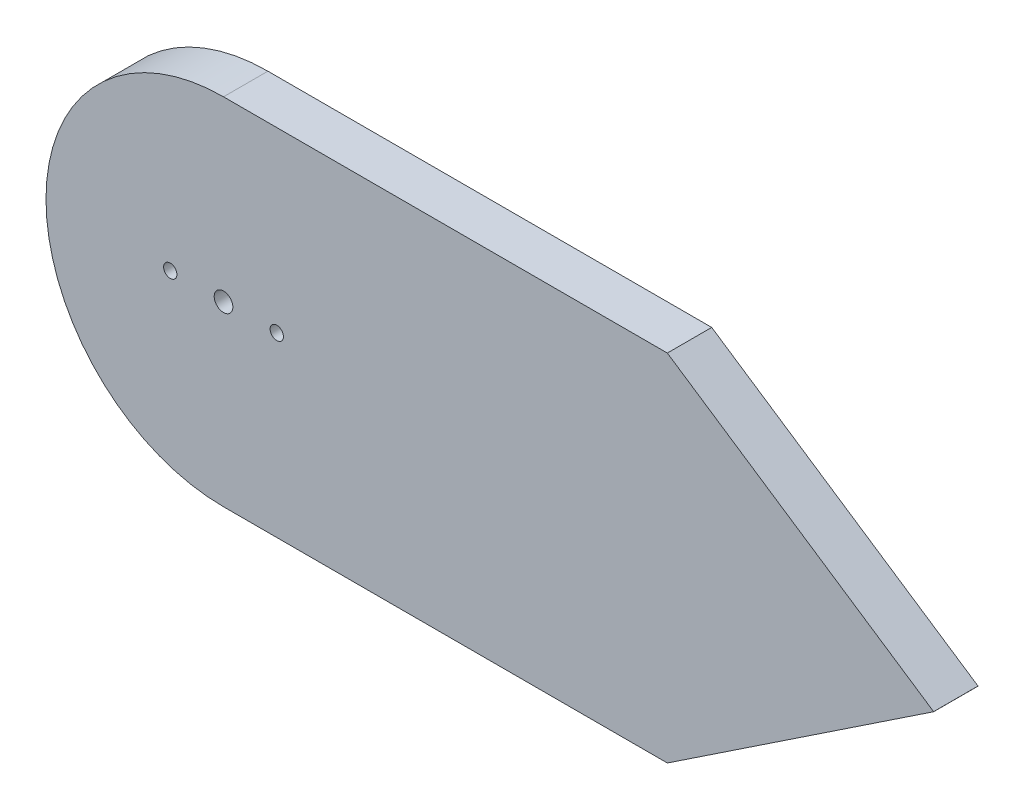
ISO-10303-21;
HEADER;
FILE_DESCRIPTION(('STEP AP214'),'2;1');
FILE_NAME('part.step','',(''),(''),'','','');
FILE_SCHEMA(('AUTOMOTIVE_DESIGN { 1 0 10303 214 1 1 1 1 }'));
ENDSEC;
DATA;
#1=APPLICATION_CONTEXT('core data for automotive mechanical design processes');
#2=APPLICATION_PROTOCOL_DEFINITION('international standard','automotive_design',2000,#1);
#3=PRODUCT_CONTEXT('',#1,'mechanical');
#4=PRODUCT('Part','Part','',(#3));
#5=PRODUCT_RELATED_PRODUCT_CATEGORY('part','',(#4));
#6=PRODUCT_DEFINITION_FORMATION('','',#4);
#7=PRODUCT_DEFINITION_CONTEXT('part definition',#1,'design');
#8=PRODUCT_DEFINITION('design','',#6,#7);
#9=PRODUCT_DEFINITION_SHAPE('','',#8);
#10=(LENGTH_UNIT() NAMED_UNIT(*) SI_UNIT(.MILLI.,.METRE.));
#11=(NAMED_UNIT(*) PLANE_ANGLE_UNIT() SI_UNIT($,.RADIAN.));
#12=(NAMED_UNIT(*) SI_UNIT($,.STERADIAN.) SOLID_ANGLE_UNIT());
#13=UNCERTAINTY_MEASURE_WITH_UNIT(LENGTH_MEASURE(1.E-05),#10,'distance_accuracy_value','');
#14=(GEOMETRIC_REPRESENTATION_CONTEXT(3) GLOBAL_UNCERTAINTY_ASSIGNED_CONTEXT((#13)) GLOBAL_UNIT_ASSIGNED_CONTEXT((#10,
#11,#12)) REPRESENTATION_CONTEXT('',''));
#15=CARTESIAN_POINT('',(0.,0.,0.));
#16=DIRECTION('',(0.,0.,1.));
#17=DIRECTION('',(1.,0.,0.));
#18=AXIS2_PLACEMENT_3D('',#15,#16,#17);
#19=CARTESIAN_POINT('',(0.,0.,2.));
#20=DIRECTION('',(0.,0.,-1.));
#21=DIRECTION('',(0.,1.,0.));
#22=AXIS2_PLACEMENT_3D('',#19,#20,#21);
#23=CYLINDRICAL_SURFACE('',#22,20.);
#24=CARTESIAN_POINT('',(0.,0.,-3.));
#25=DIRECTION('',(0.,0.,1.));
#26=DIRECTION('',(0.,-1.,0.));
#27=AXIS2_PLACEMENT_3D('',#24,#25,#26);
#28=CIRCLE('',#27,20.);
#29=CARTESIAN_POINT('',(0.,20.,-2.99999999999993));
#30=VERTEX_POINT('',#29);
#31=CARTESIAN_POINT('',(0.,-20.,-3.00000000000007));
#32=VERTEX_POINT('',#31);
#33=EDGE_CURVE('E127',#30,#32,#28,.T.);
#34=ORIENTED_EDGE('',*,*,#33,.T.);
#35=DIRECTION('',(0.,0.,-1.));
#36=VECTOR('',#35,1.);
#37=CARTESIAN_POINT('',(0.,-20.,1.99999999999993));
#38=LINE('',#37,#36);
#39=CARTESIAN_POINT('',(0.,-20.,1.99999999999993));
#40=VERTEX_POINT('',#39);
#41=EDGE_CURVE('E11',#40,#32,#38,.T.);
#42=ORIENTED_EDGE('',*,*,#41,.F.);
#43=CARTESIAN_POINT('',(0.,0.,2.));
#44=DIRECTION('',(0.,0.,1.));
#45=DIRECTION('',(0.,-1.,0.));
#46=AXIS2_PLACEMENT_3D('',#43,#44,#45);
#47=CIRCLE('',#46,20.);
#48=CARTESIAN_POINT('',(0.,20.,2.00000000000007));
#49=VERTEX_POINT('',#48);
#50=EDGE_CURVE('E87',#49,#40,#47,.T.);
#51=ORIENTED_EDGE('',*,*,#50,.F.);
#52=DIRECTION('',(0.,0.,-1.));
#53=VECTOR('',#52,1.);
#54=CARTESIAN_POINT('',(0.,20.,2.00000000000007));
#55=LINE('',#54,#53);
#56=EDGE_CURVE('E56',#49,#30,#55,.T.);
#57=ORIENTED_EDGE('',*,*,#56,.T.);
#58=EDGE_LOOP('',(#34,#42,#51,#57));
#59=FACE_BOUND('',#58,.T.);
#60=ADVANCED_FACE('F39',(#59),#23,.T.);
#61=CARTESIAN_POINT('',(50.,-20.,1.99999999999993));
#62=DIRECTION('',(0.,-1.,0.));
#63=DIRECTION('',(1.,0.,0.));
#64=AXIS2_PLACEMENT_3D('',#61,#62,#63);
#65=PLANE('',#64);
#66=DIRECTION('',(-1.,0.,0.));
#67=VECTOR('',#66,1.);
#68=CARTESIAN_POINT('',(50.,-20.,-3.00000000000007));
#69=LINE('',#68,#67);
#70=CARTESIAN_POINT('',(50.,-20.,-3.00000000000007));
#71=VERTEX_POINT('',#70);
#72=EDGE_CURVE('E130',#71,#32,#69,.T.);
#73=ORIENTED_EDGE('',*,*,#72,.F.);
#74=DIRECTION('',(0.,0.,-1.));
#75=VECTOR('',#74,1.);
#76=CARTESIAN_POINT('',(50.,-20.,1.99999999999993));
#77=LINE('',#76,#75);
#78=CARTESIAN_POINT('',(50.,-20.,1.99999999999993));
#79=VERTEX_POINT('',#78);
#80=EDGE_CURVE('E48',#79,#71,#77,.T.);
#81=ORIENTED_EDGE('',*,*,#80,.F.);
#82=DIRECTION('',(-1.,0.,0.));
#83=VECTOR('',#82,1.);
#84=CARTESIAN_POINT('',(50.,-20.,1.99999999999993));
#85=LINE('',#84,#83);
#86=EDGE_CURVE('E179',#79,#40,#85,.T.);
#87=ORIENTED_EDGE('',*,*,#86,.T.);
#88=ORIENTED_EDGE('',*,*,#41,.T.);
#89=EDGE_LOOP('',(#73,#81,#87,#88));
#90=FACE_BOUND('',#89,.T.);
#91=ADVANCED_FACE('F161',(#90),#65,.T.);
#92=CARTESIAN_POINT('',(80.,0.,2.));
#93=DIRECTION('',(0.554700196225229,-0.832050294337844,0.));
#94=DIRECTION('',(0.832050294337844,0.554700196225229,0.));
#95=AXIS2_PLACEMENT_3D('',#92,#93,#94);
#96=PLANE('',#95);
#97=DIRECTION('',(-0.832050294337844,-0.554700196225229,0.));
#98=VECTOR('',#97,1.);
#99=CARTESIAN_POINT('',(80.,0.,-3.));
#100=LINE('',#99,#98);
#101=CARTESIAN_POINT('',(80.,0.,-3.));
#102=VERTEX_POINT('',#101);
#103=EDGE_CURVE('E135',#102,#71,#100,.T.);
#104=ORIENTED_EDGE('',*,*,#103,.F.);
#105=DIRECTION('',(0.,0.,-1.));
#106=VECTOR('',#105,1.);
#107=CARTESIAN_POINT('',(80.,0.,2.));
#108=LINE('',#107,#106);
#109=CARTESIAN_POINT('',(80.,0.,2.));
#110=VERTEX_POINT('',#109);
#111=EDGE_CURVE('E116',#110,#102,#108,.T.);
#112=ORIENTED_EDGE('',*,*,#111,.F.);
#113=DIRECTION('',(-0.832050294337844,-0.554700196225229,0.));
#114=VECTOR('',#113,1.);
#115=CARTESIAN_POINT('',(80.,0.,2.));
#116=LINE('',#115,#114);
#117=EDGE_CURVE('E104',#110,#79,#116,.T.);
#118=ORIENTED_EDGE('',*,*,#117,.T.);
#119=ORIENTED_EDGE('',*,*,#80,.T.);
#120=EDGE_LOOP('',(#104,#112,#118,#119));
#121=FACE_BOUND('',#120,.T.);
#122=ADVANCED_FACE('F158',(#121),#96,.T.);
#123=CARTESIAN_POINT('',(80.,0.,2.));
#124=DIRECTION('',(-1.,0.,0.));
#125=DIRECTION('',(0.,-1.,0.));
#126=AXIS2_PLACEMENT_3D('',#123,#124,#125);
#127=PLANE('',#126);
#128=DIRECTION('',(0.,1.,0.));
#129=VECTOR('',#128,1.);
#130=CARTESIAN_POINT('',(80.,0.,-3.));
#131=LINE('',#130,#129);
#132=CARTESIAN_POINT('',(80.,0.010830805194928,-3.));
#133=VERTEX_POINT('',#132);
#134=EDGE_CURVE('E112',#102,#133,#131,.T.);
#135=ORIENTED_EDGE('',*,*,#134,.T.);
#136=DIRECTION('',(0.,0.,-1.));
#137=VECTOR('',#136,1.);
#138=CARTESIAN_POINT('',(80.,0.0108308051949105,2.));
#139=LINE('',#138,#137);
#140=CARTESIAN_POINT('',(80.,0.0108308051949105,2.));
#141=VERTEX_POINT('',#140);
#142=EDGE_CURVE('E109',#141,#133,#139,.T.);
#143=ORIENTED_EDGE('',*,*,#142,.F.);
#144=DIRECTION('',(0.,1.,0.));
#145=VECTOR('',#144,1.);
#146=CARTESIAN_POINT('',(80.,0.,2.));
#147=LINE('',#146,#145);
#148=EDGE_CURVE('E98',#110,#141,#147,.T.);
#149=ORIENTED_EDGE('',*,*,#148,.F.);
#150=ORIENTED_EDGE('',*,*,#111,.T.);
#151=EDGE_LOOP('',(#135,#143,#149,#150));
#152=FACE_BOUND('',#151,.T.);
#153=ADVANCED_FACE('F110',(#152),#127,.F.);
#154=CARTESIAN_POINT('',(50.,20.,2.00000000000007));
#155=DIRECTION('',(0.554492180210911,0.832188934127912,0.));
#156=DIRECTION('',(-0.832188934127912,0.554492180210911,0.));
#157=AXIS2_PLACEMENT_3D('',#154,#155,#156);
#158=PLANE('',#157);
#159=DIRECTION('',(0.832188934127912,-0.554492180210911,0.));
#160=VECTOR('',#159,1.);
#161=CARTESIAN_POINT('',(50.,20.,-2.99999999999993));
#162=LINE('',#161,#160);
#163=CARTESIAN_POINT('',(50.,20.,-2.99999999999993));
#164=VERTEX_POINT('',#163);
#165=EDGE_CURVE('E141',#164,#133,#162,.T.);
#166=ORIENTED_EDGE('',*,*,#165,.F.);
#167=DIRECTION('',(0.,0.,-1.));
#168=VECTOR('',#167,1.);
#169=CARTESIAN_POINT('',(50.,20.,2.00000000000007));
#170=LINE('',#169,#168);
#171=CARTESIAN_POINT('',(50.,20.,2.00000000000007));
#172=VERTEX_POINT('',#171);
#173=EDGE_CURVE('E75',#172,#164,#170,.T.);
#174=ORIENTED_EDGE('',*,*,#173,.F.);
#175=DIRECTION('',(0.832188934127912,-0.554492180210911,0.));
#176=VECTOR('',#175,1.);
#177=CARTESIAN_POINT('',(50.,20.,2.00000000000007));
#178=LINE('',#177,#176);
#179=EDGE_CURVE('E102',#172,#141,#178,.T.);
#180=ORIENTED_EDGE('',*,*,#179,.T.);
#181=ORIENTED_EDGE('',*,*,#142,.T.);
#182=EDGE_LOOP('',(#166,#174,#180,#181));
#183=FACE_BOUND('',#182,.T.);
#184=ADVANCED_FACE('F118',(#183),#158,.T.);
#185=CARTESIAN_POINT('',(0.,20.,2.00000000000007));
#186=DIRECTION('',(0.,1.,0.));
#187=DIRECTION('',(-1.,0.,0.));
#188=AXIS2_PLACEMENT_3D('',#185,#186,#187);
#189=PLANE('',#188);
#190=DIRECTION('',(1.,0.,0.));
#191=VECTOR('',#190,1.);
#192=CARTESIAN_POINT('',(0.,20.,-2.99999999999993));
#193=LINE('',#192,#191);
#194=EDGE_CURVE('E144',#30,#164,#193,.T.);
#195=ORIENTED_EDGE('',*,*,#194,.F.);
#196=ORIENTED_EDGE('',*,*,#56,.F.);
#197=DIRECTION('',(1.,0.,0.));
#198=VECTOR('',#197,1.);
#199=CARTESIAN_POINT('',(0.,20.,2.00000000000007));
#200=LINE('',#199,#198);
#201=EDGE_CURVE('E120',#49,#172,#200,.T.);
#202=ORIENTED_EDGE('',*,*,#201,.T.);
#203=ORIENTED_EDGE('',*,*,#173,.T.);
#204=EDGE_LOOP('',(#195,#196,#202,#203));
#205=FACE_BOUND('',#204,.T.);
#206=ADVANCED_FACE('F164',(#205),#189,.T.);
#207=CARTESIAN_POINT('',(0.,0.,2.));
#208=DIRECTION('',(0.,0.,1.));
#209=DIRECTION('',(0.,-1.,0.));
#210=AXIS2_PLACEMENT_3D('',#207,#208,#209);
#211=PLANE('',#210);
#212=CARTESIAN_POINT('',(6.,-0.0325899433543167,2.));
#213=DIRECTION('',(0.,0.,1.));
#214=DIRECTION('',(1.,0.,0.));
#215=AXIS2_PLACEMENT_3D('',#212,#213,#214);
#216=CIRCLE('',#215,0.749999999999998);
#217=CARTESIAN_POINT('',(6.75,-0.0325899433543167,2.));
#218=VERTEX_POINT('',#217);
#219=EDGE_CURVE('E195',#218,#218,#216,.T.);
#220=ORIENTED_EDGE('',*,*,#219,.F.);
#221=EDGE_LOOP('',(#220));
#222=FACE_BOUND('',#221,.T.);
#223=CARTESIAN_POINT('',(-5.99993497284714,0.0279342371608293,2.));
#224=DIRECTION('',(0.,0.,1.));
#225=DIRECTION('',(1.,0.,0.));
#226=AXIS2_PLACEMENT_3D('',#223,#224,#225);
#227=CIRCLE('',#226,0.749999999999999);
#228=CARTESIAN_POINT('',(-5.24993497284714,0.0279342371608293,2.));
#229=VERTEX_POINT('',#228);
#230=EDGE_CURVE('E194',#229,#229,#227,.T.);
#231=ORIENTED_EDGE('',*,*,#230,.F.);
#232=EDGE_LOOP('',(#231));
#233=FACE_BOUND('',#232,.T.);
#234=CARTESIAN_POINT('',(0.,0.,2.));
#235=DIRECTION('',(0.,0.,1.));
#236=DIRECTION('',(1.,0.,0.));
#237=AXIS2_PLACEMENT_3D('',#234,#235,#236);
#238=CIRCLE('',#237,1.05);
#239=CARTESIAN_POINT('',(1.05,0.,2.));
#240=VERTEX_POINT('',#239);
#241=EDGE_CURVE('E190',#240,#240,#238,.T.);
#242=ORIENTED_EDGE('',*,*,#241,.F.);
#243=EDGE_LOOP('',(#242));
#244=FACE_BOUND('',#243,.T.);
#245=ORIENTED_EDGE('',*,*,#50,.T.);
#246=ORIENTED_EDGE('',*,*,#86,.F.);
#247=ORIENTED_EDGE('',*,*,#117,.F.);
#248=ORIENTED_EDGE('',*,*,#148,.T.);
#249=ORIENTED_EDGE('',*,*,#179,.F.);
#250=ORIENTED_EDGE('',*,*,#201,.F.);
#251=EDGE_LOOP('',(#245,#246,#247,#248,#249,#250));
#252=FACE_BOUND('',#251,.T.);
#253=ADVANCED_FACE('F100',(#222,#233,#244,#252),#211,.T.);
#254=CARTESIAN_POINT('',(0.,0.,-3.));
#255=DIRECTION('',(0.,0.,1.));
#256=DIRECTION('',(0.,-1.,0.));
#257=AXIS2_PLACEMENT_3D('',#254,#255,#256);
#258=PLANE('',#257);
#259=CARTESIAN_POINT('',(6.,-0.0325899433543167,-3.));
#260=DIRECTION('',(0.,0.,1.));
#261=DIRECTION('',(0.,-1.,0.));
#262=AXIS2_PLACEMENT_3D('',#259,#260,#261);
#263=CIRCLE('',#262,0.749999999999998);
#264=CARTESIAN_POINT('',(6.,-0.782589943354315,-3.));
#265=VERTEX_POINT('',#264);
#266=EDGE_CURVE('E200',#265,#265,#263,.F.);
#267=ORIENTED_EDGE('',*,*,#266,.F.);
#268=EDGE_LOOP('',(#267));
#269=FACE_BOUND('',#268,.T.);
#270=CARTESIAN_POINT('',(-5.99993497284714,0.0279342371608293,-3.));
#271=DIRECTION('',(0.,0.,1.));
#272=DIRECTION('',(0.,-1.,0.));
#273=AXIS2_PLACEMENT_3D('',#270,#271,#272);
#274=CIRCLE('',#273,0.749999999999999);
#275=CARTESIAN_POINT('',(-5.99993497284714,-0.72206576283917,-3.));
#276=VERTEX_POINT('',#275);
#277=EDGE_CURVE('E199',#276,#276,#274,.F.);
#278=ORIENTED_EDGE('',*,*,#277,.F.);
#279=EDGE_LOOP('',(#278));
#280=FACE_BOUND('',#279,.T.);
#281=CARTESIAN_POINT('',(0.,0.,-3.));
#282=DIRECTION('',(0.,0.,1.));
#283=DIRECTION('',(0.,-1.,0.));
#284=AXIS2_PLACEMENT_3D('',#281,#282,#283);
#285=CIRCLE('',#284,1.05);
#286=CARTESIAN_POINT('',(0.,-1.05000000000001,-3.));
#287=VERTEX_POINT('',#286);
#288=EDGE_CURVE('E131',#287,#287,#285,.F.);
#289=ORIENTED_EDGE('',*,*,#288,.F.);
#290=EDGE_LOOP('',(#289));
#291=FACE_BOUND('',#290,.T.);
#292=ORIENTED_EDGE('',*,*,#33,.F.);
#293=ORIENTED_EDGE('',*,*,#194,.T.);
#294=ORIENTED_EDGE('',*,*,#165,.T.);
#295=ORIENTED_EDGE('',*,*,#134,.F.);
#296=ORIENTED_EDGE('',*,*,#103,.T.);
#297=ORIENTED_EDGE('',*,*,#72,.T.);
#298=EDGE_LOOP('',(#292,#293,#294,#295,#296,#297));
#299=FACE_BOUND('',#298,.T.);
#300=ADVANCED_FACE('F163',(#269,#280,#291,#299),#258,.F.);
#301=CARTESIAN_POINT('',(0.,0.,-3.00100000000007));
#302=DIRECTION('',(0.,0.,1.));
#303=DIRECTION('',(1.,0.,0.));
#304=AXIS2_PLACEMENT_3D('',#301,#302,#303);
#305=CYLINDRICAL_SURFACE('',#304,1.05);
#306=ORIENTED_EDGE('',*,*,#241,.T.);
#307=EDGE_LOOP('',(#306));
#308=FACE_BOUND('',#307,.T.);
#309=ORIENTED_EDGE('',*,*,#288,.T.);
#310=EDGE_LOOP('',(#309));
#311=FACE_BOUND('',#310,.T.);
#312=ADVANCED_FACE('F216',(#308,#311),#305,.F.);
#313=CARTESIAN_POINT('',(-5.99993497284714,0.0279342371608293,-3.00100000000007));
#314=DIRECTION('',(0.,0.,1.));
#315=DIRECTION('',(1.,0.,0.));
#316=AXIS2_PLACEMENT_3D('',#313,#314,#315);
#317=CYLINDRICAL_SURFACE('',#316,0.749999999999999);
#318=ORIENTED_EDGE('',*,*,#230,.T.);
#319=EDGE_LOOP('',(#318));
#320=FACE_BOUND('',#319,.T.);
#321=ORIENTED_EDGE('',*,*,#277,.T.);
#322=EDGE_LOOP('',(#321));
#323=FACE_BOUND('',#322,.T.);
#324=ADVANCED_FACE('F212',(#320,#323),#317,.F.);
#325=CARTESIAN_POINT('',(6.,-0.0325899433543167,-3.00100000000007));
#326=DIRECTION('',(0.,0.,1.));
#327=DIRECTION('',(1.,0.,0.));
#328=AXIS2_PLACEMENT_3D('',#325,#326,#327);
#329=CYLINDRICAL_SURFACE('',#328,0.749999999999998);
#330=ORIENTED_EDGE('',*,*,#219,.T.);
#331=EDGE_LOOP('',(#330));
#332=FACE_BOUND('',#331,.T.);
#333=ORIENTED_EDGE('',*,*,#266,.T.);
#334=EDGE_LOOP('',(#333));
#335=FACE_BOUND('',#334,.T.);
#336=ADVANCED_FACE('F226',(#332,#335),#329,.F.);
#337=CLOSED_SHELL('',(#60,#91,#122,#153,#184,#206,#253,#300,#312,#324,#336));
#338=MANIFOLD_SOLID_BREP('B2',#337);
#339=ADVANCED_BREP_SHAPE_REPRESENTATION('',(#18,#338),#14);
#340=SHAPE_DEFINITION_REPRESENTATION(#9,#339);
ENDSEC;
END-ISO-10303-21;
